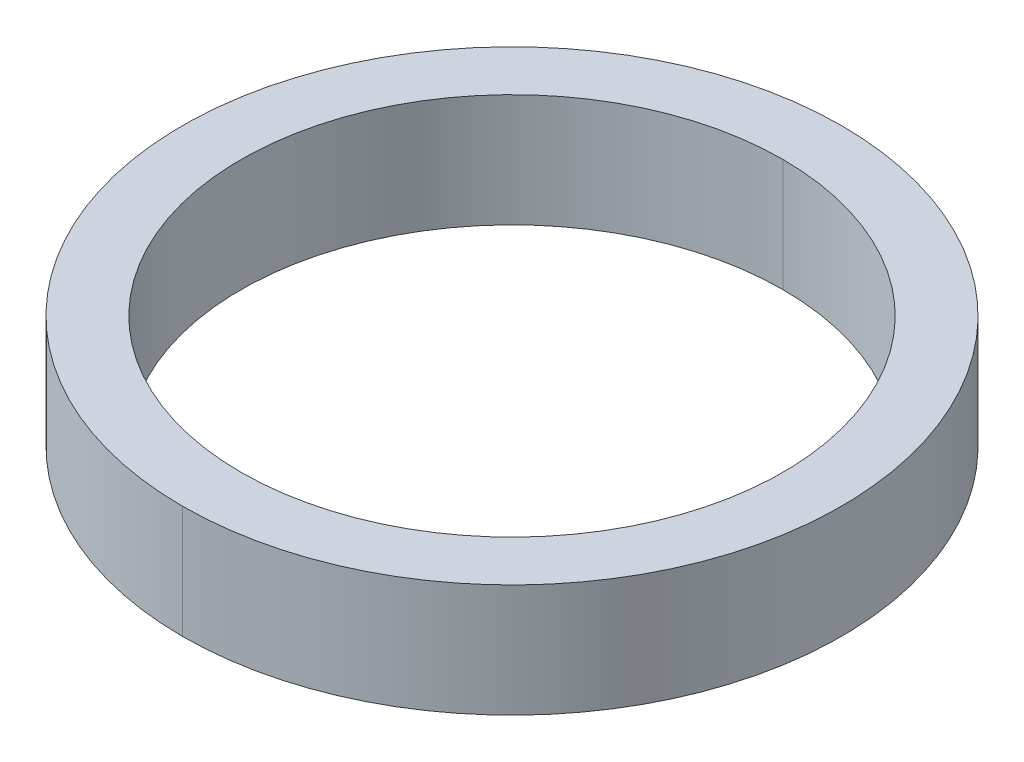
ISO-10303-21;
HEADER;
FILE_DESCRIPTION(('STEP AP214'),'2;1');
FILE_NAME('part.step','',(''),(''),'','','');
FILE_SCHEMA(('AUTOMOTIVE_DESIGN { 1 0 10303 214 1 1 1 1 }'));
ENDSEC;
DATA;
#1=APPLICATION_CONTEXT('core data for automotive mechanical design processes');
#2=APPLICATION_PROTOCOL_DEFINITION('international standard','automotive_design',2000,#1);
#3=PRODUCT_CONTEXT('',#1,'mechanical');
#4=PRODUCT('Part','Part','',(#3));
#5=PRODUCT_RELATED_PRODUCT_CATEGORY('part','',(#4));
#6=PRODUCT_DEFINITION_FORMATION('','',#4);
#7=PRODUCT_DEFINITION_CONTEXT('part definition',#1,'design');
#8=PRODUCT_DEFINITION('design','',#6,#7);
#9=PRODUCT_DEFINITION_SHAPE('','',#8);
#10=(LENGTH_UNIT() NAMED_UNIT(*) SI_UNIT(.MILLI.,.METRE.));
#11=(NAMED_UNIT(*) PLANE_ANGLE_UNIT() SI_UNIT($,.RADIAN.));
#12=(NAMED_UNIT(*) SI_UNIT($,.STERADIAN.) SOLID_ANGLE_UNIT());
#13=UNCERTAINTY_MEASURE_WITH_UNIT(LENGTH_MEASURE(1.E-05),#10,'distance_accuracy_value','');
#14=(GEOMETRIC_REPRESENTATION_CONTEXT(3) GLOBAL_UNCERTAINTY_ASSIGNED_CONTEXT((#13)) GLOBAL_UNIT_ASSIGNED_CONTEXT((#10,
#11,#12)) REPRESENTATION_CONTEXT('',''));
#15=CARTESIAN_POINT('',(0.,0.,0.));
#16=DIRECTION('',(0.,0.,1.));
#17=DIRECTION('',(1.,0.,0.));
#18=AXIS2_PLACEMENT_3D('',#15,#16,#17);
#19=CARTESIAN_POINT('',(0.,7.7,0.));
#20=DIRECTION('',(0.,-1.,0.));
#21=DIRECTION('',(0.,0.,-1.));
#22=AXIS2_PLACEMENT_3D('',#19,#20,#21);
#23=CYLINDRICAL_SURFACE('',#22,18.5);
#24=DIRECTION('',(0.,-1.,0.));
#25=VECTOR('',#24,1.);
#26=CARTESIAN_POINT('',(0.,7.7,18.5));
#27=LINE('',#26,#25);
#28=CARTESIAN_POINT('',(0.,7.7,18.5));
#29=VERTEX_POINT('',#28);
#30=CARTESIAN_POINT('',(0.,0.,18.5));
#31=VERTEX_POINT('',#30);
#32=EDGE_CURVE('E76',#29,#31,#27,.T.);
#33=ORIENTED_EDGE('',*,*,#32,.F.);
#34=CARTESIAN_POINT('',(0.,7.7,0.));
#35=DIRECTION('',(0.,1.,0.));
#36=DIRECTION('',(0.,0.,1.));
#37=AXIS2_PLACEMENT_3D('',#34,#35,#36);
#38=CIRCLE('',#37,18.5);
#39=CARTESIAN_POINT('',(0.,7.7,-18.5));
#40=VERTEX_POINT('',#39);
#41=EDGE_CURVE('E75',#29,#40,#38,.T.);
#42=ORIENTED_EDGE('',*,*,#41,.T.);
#43=DIRECTION('',(0.,-1.,0.));
#44=VECTOR('',#43,1.);
#45=CARTESIAN_POINT('',(0.,7.7,-18.5));
#46=LINE('',#45,#44);
#47=CARTESIAN_POINT('',(0.,0.,-18.5));
#48=VERTEX_POINT('',#47);
#49=EDGE_CURVE('E73',#40,#48,#46,.T.);
#50=ORIENTED_EDGE('',*,*,#49,.T.);
#51=CARTESIAN_POINT('',(0.,0.,0.));
#52=DIRECTION('',(0.,1.,0.));
#53=DIRECTION('',(0.,0.,1.));
#54=AXIS2_PLACEMENT_3D('',#51,#52,#53);
#55=CIRCLE('',#54,18.5);
#56=EDGE_CURVE('E11',#31,#48,#55,.T.);
#57=ORIENTED_EDGE('',*,*,#56,.F.);
#58=EDGE_LOOP('',(#33,#42,#50,#57));
#59=FACE_BOUND('',#58,.T.);
#60=ADVANCED_FACE('F17',(#59),#23,.F.);
#61=CARTESIAN_POINT('',(0.,7.7,0.));
#62=DIRECTION('',(0.,-1.,0.));
#63=DIRECTION('',(0.,0.,-1.));
#64=AXIS2_PLACEMENT_3D('',#61,#62,#63);
#65=CYLINDRICAL_SURFACE('',#64,22.5);
#66=DIRECTION('',(0.,-1.,0.));
#67=VECTOR('',#66,1.);
#68=CARTESIAN_POINT('',(0.,7.7,22.5));
#69=LINE('',#68,#67);
#70=CARTESIAN_POINT('',(0.,7.7,22.5));
#71=VERTEX_POINT('',#70);
#72=CARTESIAN_POINT('',(0.,0.,22.5));
#73=VERTEX_POINT('',#72);
#74=EDGE_CURVE('E104',#71,#73,#69,.T.);
#75=ORIENTED_EDGE('',*,*,#74,.F.);
#76=CARTESIAN_POINT('',(0.,7.7,0.));
#77=DIRECTION('',(0.,1.,0.));
#78=DIRECTION('',(0.,0.,1.));
#79=AXIS2_PLACEMENT_3D('',#76,#77,#78);
#80=CIRCLE('',#79,22.5);
#81=CARTESIAN_POINT('',(0.,7.7,-22.5));
#82=VERTEX_POINT('',#81);
#83=EDGE_CURVE('E82',#82,#71,#80,.T.);
#84=ORIENTED_EDGE('',*,*,#83,.F.);
#85=DIRECTION('',(0.,-1.,0.));
#86=VECTOR('',#85,1.);
#87=CARTESIAN_POINT('',(0.,7.7,-22.5));
#88=LINE('',#87,#86);
#89=CARTESIAN_POINT('',(0.,0.,-22.5));
#90=VERTEX_POINT('',#89);
#91=EDGE_CURVE('E114',#82,#90,#88,.T.);
#92=ORIENTED_EDGE('',*,*,#91,.T.);
#93=CARTESIAN_POINT('',(0.,0.,0.));
#94=DIRECTION('',(0.,1.,0.));
#95=DIRECTION('',(0.,0.,1.));
#96=AXIS2_PLACEMENT_3D('',#93,#94,#95);
#97=CIRCLE('',#96,22.5);
#98=EDGE_CURVE('E25',#90,#73,#97,.T.);
#99=ORIENTED_EDGE('',*,*,#98,.T.);
#100=EDGE_LOOP('',(#75,#84,#92,#99));
#101=FACE_BOUND('',#100,.T.);
#102=ADVANCED_FACE('F162',(#101),#65,.T.);
#103=CARTESIAN_POINT('',(0.,0.,0.));
#104=DIRECTION('',(0.,1.,0.));
#105=DIRECTION('',(1.,0.,0.));
#106=AXIS2_PLACEMENT_3D('',#103,#104,#105);
#107=PLANE('',#106);
#108=CARTESIAN_POINT('',(0.,0.,0.));
#109=DIRECTION('',(0.,1.,0.));
#110=DIRECTION('',(0.,0.,1.));
#111=AXIS2_PLACEMENT_3D('',#108,#109,#110);
#112=CIRCLE('',#111,18.5);
#113=EDGE_CURVE('E87',#48,#31,#112,.T.);
#114=ORIENTED_EDGE('',*,*,#113,.T.);
#115=ORIENTED_EDGE('',*,*,#56,.T.);
#116=EDGE_LOOP('',(#114,#115));
#117=FACE_BOUND('',#116,.T.);
#118=ORIENTED_EDGE('',*,*,#98,.F.);
#119=CARTESIAN_POINT('',(0.,0.,0.));
#120=DIRECTION('',(0.,1.,0.));
#121=DIRECTION('',(0.,0.,1.));
#122=AXIS2_PLACEMENT_3D('',#119,#120,#121);
#123=CIRCLE('',#122,22.5);
#124=EDGE_CURVE('E107',#73,#90,#123,.T.);
#125=ORIENTED_EDGE('',*,*,#124,.F.);
#126=EDGE_LOOP('',(#118,#125));
#127=FACE_BOUND('',#126,.T.);
#128=ADVANCED_FACE('F152',(#117,#127),#107,.F.);
#129=CARTESIAN_POINT('',(0.,7.7,0.));
#130=DIRECTION('',(0.,1.,0.));
#131=DIRECTION('',(1.,0.,0.));
#132=AXIS2_PLACEMENT_3D('',#129,#130,#131);
#133=PLANE('',#132);
#134=CARTESIAN_POINT('',(0.,7.7,0.));
#135=DIRECTION('',(0.,1.,0.));
#136=DIRECTION('',(0.,0.,1.));
#137=AXIS2_PLACEMENT_3D('',#134,#135,#136);
#138=CIRCLE('',#137,18.5);
#139=EDGE_CURVE('E83',#40,#29,#138,.T.);
#140=ORIENTED_EDGE('',*,*,#139,.F.);
#141=ORIENTED_EDGE('',*,*,#41,.F.);
#142=EDGE_LOOP('',(#140,#141));
#143=FACE_BOUND('',#142,.T.);
#144=ORIENTED_EDGE('',*,*,#83,.T.);
#145=CARTESIAN_POINT('',(0.,7.7,0.));
#146=DIRECTION('',(0.,1.,0.));
#147=DIRECTION('',(0.,0.,1.));
#148=AXIS2_PLACEMENT_3D('',#145,#146,#147);
#149=CIRCLE('',#148,22.5);
#150=EDGE_CURVE('E90',#71,#82,#149,.T.);
#151=ORIENTED_EDGE('',*,*,#150,.T.);
#152=EDGE_LOOP('',(#144,#151));
#153=FACE_BOUND('',#152,.T.);
#154=ADVANCED_FACE('F93',(#143,#153),#133,.T.);
#155=CARTESIAN_POINT('',(0.,7.7,0.));
#156=DIRECTION('',(0.,-1.,0.));
#157=DIRECTION('',(0.,0.,-1.));
#158=AXIS2_PLACEMENT_3D('',#155,#156,#157);
#159=CYLINDRICAL_SURFACE('',#158,22.5);
#160=ORIENTED_EDGE('',*,*,#150,.F.);
#161=ORIENTED_EDGE('',*,*,#74,.T.);
#162=ORIENTED_EDGE('',*,*,#124,.T.);
#163=ORIENTED_EDGE('',*,*,#91,.F.);
#164=EDGE_LOOP('',(#160,#161,#162,#163));
#165=FACE_BOUND('',#164,.T.);
#166=ADVANCED_FACE('F134',(#165),#159,.T.);
#167=CARTESIAN_POINT('',(0.,7.7,0.));
#168=DIRECTION('',(0.,-1.,0.));
#169=DIRECTION('',(0.,0.,-1.));
#170=AXIS2_PLACEMENT_3D('',#167,#168,#169);
#171=CYLINDRICAL_SURFACE('',#170,18.5);
#172=ORIENTED_EDGE('',*,*,#139,.T.);
#173=ORIENTED_EDGE('',*,*,#32,.T.);
#174=ORIENTED_EDGE('',*,*,#113,.F.);
#175=ORIENTED_EDGE('',*,*,#49,.F.);
#176=EDGE_LOOP('',(#172,#173,#174,#175));
#177=FACE_BOUND('',#176,.T.);
#178=ADVANCED_FACE('F81',(#177),#171,.F.);
#179=CLOSED_SHELL('',(#60,#102,#128,#154,#166,#178));
#180=MANIFOLD_SOLID_BREP('B1',#179);
#181=ADVANCED_BREP_SHAPE_REPRESENTATION('',(#18,#180),#14);
#182=SHAPE_DEFINITION_REPRESENTATION(#9,#181);
ENDSEC;
END-ISO-10303-21;
